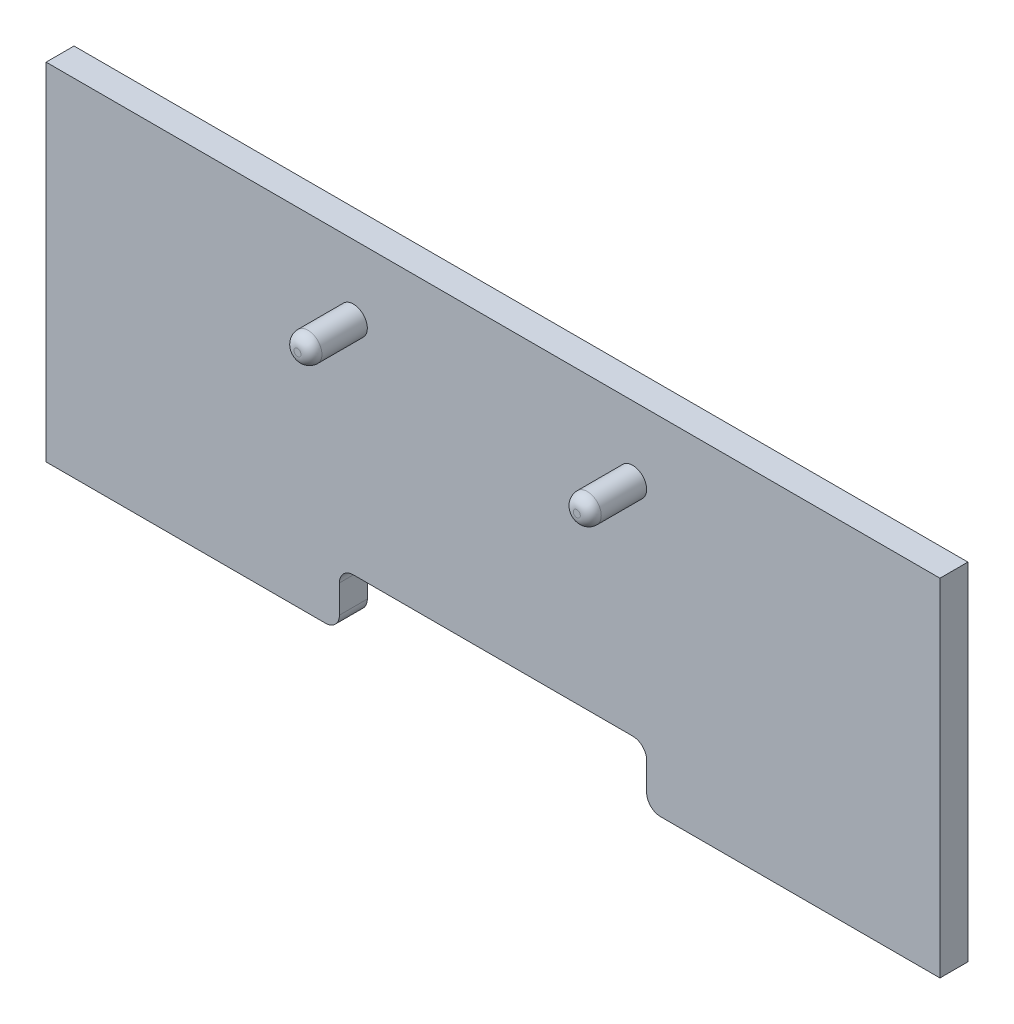
ISO-10303-21;
HEADER;
FILE_DESCRIPTION(('STEP AP214'),'2;1');
FILE_NAME('part.step','',(''),(''),'','','');
FILE_SCHEMA(('AUTOMOTIVE_DESIGN { 1 0 10303 214 1 1 1 1 }'));
ENDSEC;
DATA;
#1=APPLICATION_CONTEXT('core data for automotive mechanical design processes');
#2=APPLICATION_PROTOCOL_DEFINITION('international standard','automotive_design',2000,#1);
#3=PRODUCT_CONTEXT('',#1,'mechanical');
#4=PRODUCT('Part','Part','',(#3));
#5=PRODUCT_RELATED_PRODUCT_CATEGORY('part','',(#4));
#6=PRODUCT_DEFINITION_FORMATION('','',#4);
#7=PRODUCT_DEFINITION_CONTEXT('part definition',#1,'design');
#8=PRODUCT_DEFINITION('design','',#6,#7);
#9=PRODUCT_DEFINITION_SHAPE('','',#8);
#10=(LENGTH_UNIT() NAMED_UNIT(*) SI_UNIT(.MILLI.,.METRE.));
#11=(NAMED_UNIT(*) PLANE_ANGLE_UNIT() SI_UNIT($,.RADIAN.));
#12=(NAMED_UNIT(*) SI_UNIT($,.STERADIAN.) SOLID_ANGLE_UNIT());
#13=UNCERTAINTY_MEASURE_WITH_UNIT(LENGTH_MEASURE(1.E-05),#10,'distance_accuracy_value','');
#14=(GEOMETRIC_REPRESENTATION_CONTEXT(3) GLOBAL_UNCERTAINTY_ASSIGNED_CONTEXT((#13)) GLOBAL_UNIT_ASSIGNED_CONTEXT((#10,
#11,#12)) REPRESENTATION_CONTEXT('',''));
#15=CARTESIAN_POINT('',(0.,0.,0.));
#16=DIRECTION('',(0.,0.,1.));
#17=DIRECTION('',(1.,0.,0.));
#18=AXIS2_PLACEMENT_3D('',#15,#16,#17);
#19=CARTESIAN_POINT('',(0.,0.,6.35));
#20=DIRECTION('',(0.,1.,0.));
#21=DIRECTION('',(0.,0.,1.));
#22=AXIS2_PLACEMENT_3D('',#19,#20,#21);
#23=PLANE('',#22);
#24=DIRECTION('',(1.,0.,0.));
#25=VECTOR('',#24,1.);
#26=CARTESIAN_POINT('',(0.,0.,0.));
#27=LINE('',#26,#25);
#28=CARTESIAN_POINT('',(0.,0.,0.));
#29=VERTEX_POINT('',#28);
#30=CARTESIAN_POINT('',(63.5,0.,0.));
#31=VERTEX_POINT('',#30);
#32=EDGE_CURVE('E272',#29,#31,#27,.T.);
#33=ORIENTED_EDGE('',*,*,#32,.T.);
#34=DIRECTION('',(0.,0.,1.));
#35=VECTOR('',#34,1.);
#36=CARTESIAN_POINT('',(63.5,0.,6.35));
#37=LINE('',#36,#35);
#38=CARTESIAN_POINT('',(63.5,0.,6.35));
#39=VERTEX_POINT('',#38);
#40=EDGE_CURVE('E137',#31,#39,#37,.T.);
#41=ORIENTED_EDGE('',*,*,#40,.T.);
#42=DIRECTION('',(1.,0.,0.));
#43=VECTOR('',#42,1.);
#44=CARTESIAN_POINT('',(0.,0.,6.35));
#45=LINE('',#44,#43);
#46=CARTESIAN_POINT('',(0.,0.,6.35));
#47=VERTEX_POINT('',#46);
#48=EDGE_CURVE('E130',#47,#39,#45,.T.);
#49=ORIENTED_EDGE('',*,*,#48,.F.);
#50=DIRECTION('',(0.,0.,-1.));
#51=VECTOR('',#50,1.);
#52=CARTESIAN_POINT('',(0.,0.,6.35));
#53=LINE('',#52,#51);
#54=EDGE_CURVE('E134',#47,#29,#53,.T.);
#55=ORIENTED_EDGE('',*,*,#54,.T.);
#56=EDGE_LOOP('',(#33,#41,#49,#55));
#57=FACE_BOUND('',#56,.T.);
#58=ADVANCED_FACE('F38',(#57),#23,.F.);
#59=CARTESIAN_POINT('',(0.,0.,6.35));
#60=DIRECTION('',(1.,0.,0.));
#61=DIRECTION('',(0.,0.,-1.));
#62=AXIS2_PLACEMENT_3D('',#59,#60,#61);
#63=PLANE('',#62);
#64=DIRECTION('',(0.,-1.,0.));
#65=VECTOR('',#64,1.);
#66=CARTESIAN_POINT('',(0.,0.,0.));
#67=LINE('',#66,#65);
#68=CARTESIAN_POINT('',(0.,78.7146,0.));
#69=VERTEX_POINT('',#68);
#70=EDGE_CURVE('E155',#69,#29,#67,.T.);
#71=ORIENTED_EDGE('',*,*,#70,.T.);
#72=ORIENTED_EDGE('',*,*,#54,.F.);
#73=DIRECTION('',(0.,-1.,0.));
#74=VECTOR('',#73,1.);
#75=CARTESIAN_POINT('',(0.,0.,6.35));
#76=LINE('',#75,#74);
#77=CARTESIAN_POINT('',(0.,78.7146,6.35));
#78=VERTEX_POINT('',#77);
#79=EDGE_CURVE('E143',#78,#47,#76,.T.);
#80=ORIENTED_EDGE('',*,*,#79,.F.);
#81=DIRECTION('',(0.,0.,-1.));
#82=VECTOR('',#81,1.);
#83=CARTESIAN_POINT('',(0.,78.7146,6.35));
#84=LINE('',#83,#82);
#85=EDGE_CURVE('E270',#78,#69,#84,.T.);
#86=ORIENTED_EDGE('',*,*,#85,.T.);
#87=EDGE_LOOP('',(#71,#72,#80,#86));
#88=FACE_BOUND('',#87,.T.);
#89=ADVANCED_FACE('F153',(#88),#63,.F.);
#90=CARTESIAN_POINT('',(139.7,0.,6.35));
#91=VERTEX_POINT('',#90);
#92=CARTESIAN_POINT('',(203.2,0.,6.35));
#93=VERTEX_POINT('',#92);
#94=EDGE_CURVE('E140',#91,#93,#45,.T.);
#95=ORIENTED_EDGE('',*,*,#94,.F.);
#96=DIRECTION('',(0.,0.,1.));
#97=VECTOR('',#96,1.);
#98=CARTESIAN_POINT('',(139.7,0.,6.35));
#99=LINE('',#98,#97);
#100=CARTESIAN_POINT('',(139.7,0.,0.));
#101=VERTEX_POINT('',#100);
#102=EDGE_CURVE('E172',#91,#101,#99,.F.);
#103=ORIENTED_EDGE('',*,*,#102,.T.);
#104=CARTESIAN_POINT('',(203.2,0.,0.));
#105=VERTEX_POINT('',#104);
#106=EDGE_CURVE('E249',#101,#105,#27,.T.);
#107=ORIENTED_EDGE('',*,*,#106,.T.);
#108=DIRECTION('',(0.,0.,-1.));
#109=VECTOR('',#108,1.);
#110=CARTESIAN_POINT('',(203.2,0.,6.35));
#111=LINE('',#110,#109);
#112=EDGE_CURVE('E157',#93,#105,#111,.T.);
#113=ORIENTED_EDGE('',*,*,#112,.F.);
#114=EDGE_LOOP('',(#95,#103,#107,#113));
#115=FACE_BOUND('',#114,.T.);
#116=ADVANCED_FACE('F222',(#115),#23,.F.);
#117=CARTESIAN_POINT('',(203.2,0.,6.35));
#118=DIRECTION('',(-1.,0.,0.));
#119=DIRECTION('',(0.,0.,1.));
#120=AXIS2_PLACEMENT_3D('',#117,#118,#119);
#121=PLANE('',#120);
#122=DIRECTION('',(0.,1.,0.));
#123=VECTOR('',#122,1.);
#124=CARTESIAN_POINT('',(203.2,0.,0.));
#125=LINE('',#124,#123);
#126=CARTESIAN_POINT('',(203.2,78.7146,0.));
#127=VERTEX_POINT('',#126);
#128=EDGE_CURVE('E274',#105,#127,#125,.T.);
#129=ORIENTED_EDGE('',*,*,#128,.T.);
#130=DIRECTION('',(0.,0.,-1.));
#131=VECTOR('',#130,1.);
#132=CARTESIAN_POINT('',(203.2,78.7146,6.35));
#133=LINE('',#132,#131);
#134=CARTESIAN_POINT('',(203.2,78.7146,6.35));
#135=VERTEX_POINT('',#134);
#136=EDGE_CURVE('E162',#135,#127,#133,.T.);
#137=ORIENTED_EDGE('',*,*,#136,.F.);
#138=DIRECTION('',(0.,1.,0.));
#139=VECTOR('',#138,1.);
#140=CARTESIAN_POINT('',(203.2,0.,6.35));
#141=LINE('',#140,#139);
#142=EDGE_CURVE('E139',#93,#135,#141,.T.);
#143=ORIENTED_EDGE('',*,*,#142,.F.);
#144=ORIENTED_EDGE('',*,*,#112,.T.);
#145=EDGE_LOOP('',(#129,#137,#143,#144));
#146=FACE_BOUND('',#145,.T.);
#147=ADVANCED_FACE('F229',(#146),#121,.F.);
#148=CARTESIAN_POINT('',(0.,78.7146,6.35));
#149=DIRECTION('',(0.,-1.,0.));
#150=DIRECTION('',(0.,0.,-1.));
#151=AXIS2_PLACEMENT_3D('',#148,#149,#150);
#152=PLANE('',#151);
#153=DIRECTION('',(-1.,0.,0.));
#154=VECTOR('',#153,1.);
#155=CARTESIAN_POINT('',(0.,78.7146,0.));
#156=LINE('',#155,#154);
#157=EDGE_CURVE('E151',#127,#69,#156,.T.);
#158=ORIENTED_EDGE('',*,*,#157,.T.);
#159=ORIENTED_EDGE('',*,*,#85,.F.);
#160=DIRECTION('',(-1.,0.,0.));
#161=VECTOR('',#160,1.);
#162=CARTESIAN_POINT('',(0.,78.7146,6.35));
#163=LINE('',#162,#161);
#164=EDGE_CURVE('E147',#135,#78,#163,.T.);
#165=ORIENTED_EDGE('',*,*,#164,.F.);
#166=ORIENTED_EDGE('',*,*,#136,.T.);
#167=EDGE_LOOP('',(#158,#159,#165,#166));
#168=FACE_BOUND('',#167,.T.);
#169=ADVANCED_FACE('F234',(#168),#152,.F.);
#170=CARTESIAN_POINT('',(0.,0.,6.35));
#171=DIRECTION('',(0.,0.,-1.));
#172=DIRECTION('',(-1.,0.,0.));
#173=AXIS2_PLACEMENT_3D('',#170,#171,#172);
#174=PLANE('',#173);
#175=CARTESIAN_POINT('',(133.35,62.8396,6.35));
#176=DIRECTION('',(0.,0.,-1.));
#177=DIRECTION('',(-1.,0.,0.));
#178=AXIS2_PLACEMENT_3D('',#175,#176,#177);
#179=CIRCLE('',#178,3.175);
#180=CARTESIAN_POINT('',(130.175,62.8396,6.35));
#181=VERTEX_POINT('',#180);
#182=EDGE_CURVE('E198',#181,#181,#179,.F.);
#183=ORIENTED_EDGE('',*,*,#182,.F.);
#184=EDGE_LOOP('',(#183));
#185=FACE_BOUND('',#184,.T.);
#186=CARTESIAN_POINT('',(69.85,62.8396,6.35));
#187=DIRECTION('',(0.,0.,-1.));
#188=DIRECTION('',(-1.,0.,0.));
#189=AXIS2_PLACEMENT_3D('',#186,#187,#188);
#190=CIRCLE('',#189,3.175);
#191=CARTESIAN_POINT('',(66.675,62.8396,6.35));
#192=VERTEX_POINT('',#191);
#193=EDGE_CURVE('E195',#192,#192,#190,.F.);
#194=ORIENTED_EDGE('',*,*,#193,.F.);
#195=EDGE_LOOP('',(#194));
#196=FACE_BOUND('',#195,.T.);
#197=DIRECTION('',(0.,1.,0.));
#198=VECTOR('',#197,1.);
#199=CARTESIAN_POINT('',(136.525,0.,6.35));
#200=LINE('',#199,#198);
#201=CARTESIAN_POINT('',(136.525,3.175,6.35));
#202=VERTEX_POINT('',#201);
#203=CARTESIAN_POINT('',(136.525,9.52500000000001,6.35));
#204=VERTEX_POINT('',#203);
#205=EDGE_CURVE('E265',#202,#204,#200,.T.);
#206=ORIENTED_EDGE('',*,*,#205,.F.);
#207=CARTESIAN_POINT('',(139.7,3.175,6.35));
#208=DIRECTION('',(0.,0.,-1.));
#209=DIRECTION('',(-1.,0.,0.));
#210=AXIS2_PLACEMENT_3D('',#207,#208,#209);
#211=CIRCLE('',#210,3.175);
#212=EDGE_CURVE('E170',#202,#91,#211,.F.);
#213=ORIENTED_EDGE('',*,*,#212,.T.);
#214=ORIENTED_EDGE('',*,*,#94,.T.);
#215=ORIENTED_EDGE('',*,*,#142,.T.);
#216=ORIENTED_EDGE('',*,*,#164,.T.);
#217=ORIENTED_EDGE('',*,*,#79,.T.);
#218=ORIENTED_EDGE('',*,*,#48,.T.);
#219=CARTESIAN_POINT('',(63.5,3.175,6.35));
#220=DIRECTION('',(0.,0.,-1.));
#221=DIRECTION('',(-1.,0.,0.));
#222=AXIS2_PLACEMENT_3D('',#219,#220,#221);
#223=CIRCLE('',#222,3.175);
#224=CARTESIAN_POINT('',(66.675,3.175,6.35));
#225=VERTEX_POINT('',#224);
#226=EDGE_CURVE('E168',#39,#225,#223,.F.);
#227=ORIENTED_EDGE('',*,*,#226,.T.);
#228=DIRECTION('',(0.,-1.,0.));
#229=VECTOR('',#228,1.);
#230=CARTESIAN_POINT('',(66.675,0.,6.35));
#231=LINE('',#230,#229);
#232=CARTESIAN_POINT('',(66.675,9.525,6.35));
#233=VERTEX_POINT('',#232);
#234=EDGE_CURVE('E262',#233,#225,#231,.T.);
#235=ORIENTED_EDGE('',*,*,#234,.F.);
#236=CARTESIAN_POINT('',(69.85,9.525,6.35));
#237=DIRECTION('',(0.,0.,-1.));
#238=DIRECTION('',(-1.,0.,0.));
#239=AXIS2_PLACEMENT_3D('',#236,#237,#238);
#240=CIRCLE('',#239,3.175);
#241=CARTESIAN_POINT('',(69.85,12.7,6.35));
#242=VERTEX_POINT('',#241);
#243=EDGE_CURVE('E191',#233,#242,#240,.T.);
#244=ORIENTED_EDGE('',*,*,#243,.T.);
#245=DIRECTION('',(-1.,0.,0.));
#246=VECTOR('',#245,1.);
#247=CARTESIAN_POINT('',(66.675,12.7,6.35));
#248=LINE('',#247,#246);
#249=CARTESIAN_POINT('',(133.35,12.7,6.35));
#250=VERTEX_POINT('',#249);
#251=EDGE_CURVE('E259',#250,#242,#248,.T.);
#252=ORIENTED_EDGE('',*,*,#251,.F.);
#253=CARTESIAN_POINT('',(133.35,9.52500000000001,6.35));
#254=DIRECTION('',(0.,0.,-1.));
#255=DIRECTION('',(-1.,0.,0.));
#256=AXIS2_PLACEMENT_3D('',#253,#254,#255);
#257=CIRCLE('',#256,3.175);
#258=EDGE_CURVE('E188',#250,#204,#257,.T.);
#259=ORIENTED_EDGE('',*,*,#258,.T.);
#260=EDGE_LOOP('',(#206,#213,#214,#215,#216,#217,#218,#227,#235,#244,#252,#259));
#261=FACE_BOUND('',#260,.T.);
#262=ADVANCED_FACE('F145',(#185,#196,#261),#174,.F.);
#263=CARTESIAN_POINT('',(0.,0.,0.));
#264=DIRECTION('',(0.,0.,-1.));
#265=DIRECTION('',(-1.,0.,0.));
#266=AXIS2_PLACEMENT_3D('',#263,#264,#265);
#267=PLANE('',#266);
#268=ORIENTED_EDGE('',*,*,#106,.F.);
#269=CARTESIAN_POINT('',(139.7,3.175,0.));
#270=DIRECTION('',(0.,0.,-1.));
#271=DIRECTION('',(-1.,0.,0.));
#272=AXIS2_PLACEMENT_3D('',#269,#270,#271);
#273=CIRCLE('',#272,3.175);
#274=CARTESIAN_POINT('',(136.525,3.175,0.));
#275=VERTEX_POINT('',#274);
#276=EDGE_CURVE('E176',#101,#275,#273,.T.);
#277=ORIENTED_EDGE('',*,*,#276,.T.);
#278=DIRECTION('',(0.,1.,0.));
#279=VECTOR('',#278,1.);
#280=CARTESIAN_POINT('',(136.525,0.,0.));
#281=LINE('',#280,#279);
#282=CARTESIAN_POINT('',(136.525,9.52500000000001,0.));
#283=VERTEX_POINT('',#282);
#284=EDGE_CURVE('E247',#275,#283,#281,.T.);
#285=ORIENTED_EDGE('',*,*,#284,.T.);
#286=CARTESIAN_POINT('',(133.35,9.52500000000001,0.));
#287=DIRECTION('',(0.,0.,-1.));
#288=DIRECTION('',(-1.,0.,0.));
#289=AXIS2_PLACEMENT_3D('',#286,#287,#288);
#290=CIRCLE('',#289,3.175);
#291=CARTESIAN_POINT('',(133.35,12.7,0.));
#292=VERTEX_POINT('',#291);
#293=EDGE_CURVE('E60',#283,#292,#290,.F.);
#294=ORIENTED_EDGE('',*,*,#293,.T.);
#295=DIRECTION('',(-1.,0.,0.));
#296=VECTOR('',#295,1.);
#297=CARTESIAN_POINT('',(66.675,12.7,0.));
#298=LINE('',#297,#296);
#299=CARTESIAN_POINT('',(69.85,12.7,0.));
#300=VERTEX_POINT('',#299);
#301=EDGE_CURVE('E254',#292,#300,#298,.T.);
#302=ORIENTED_EDGE('',*,*,#301,.T.);
#303=CARTESIAN_POINT('',(69.85,9.525,0.));
#304=DIRECTION('',(0.,0.,-1.));
#305=DIRECTION('',(-1.,0.,0.));
#306=AXIS2_PLACEMENT_3D('',#303,#304,#305);
#307=CIRCLE('',#306,3.175);
#308=CARTESIAN_POINT('',(66.675,9.525,0.));
#309=VERTEX_POINT('',#308);
#310=EDGE_CURVE('E193',#300,#309,#307,.F.);
#311=ORIENTED_EDGE('',*,*,#310,.T.);
#312=DIRECTION('',(0.,-1.,0.));
#313=VECTOR('',#312,1.);
#314=CARTESIAN_POINT('',(66.675,0.,0.));
#315=LINE('',#314,#313);
#316=CARTESIAN_POINT('',(66.675,3.175,0.));
#317=VERTEX_POINT('',#316);
#318=EDGE_CURVE('E255',#309,#317,#315,.T.);
#319=ORIENTED_EDGE('',*,*,#318,.T.);
#320=CARTESIAN_POINT('',(63.5,3.175,0.));
#321=DIRECTION('',(0.,0.,-1.));
#322=DIRECTION('',(-1.,0.,0.));
#323=AXIS2_PLACEMENT_3D('',#320,#321,#322);
#324=CIRCLE('',#323,3.175);
#325=EDGE_CURVE('E174',#317,#31,#324,.T.);
#326=ORIENTED_EDGE('',*,*,#325,.T.);
#327=ORIENTED_EDGE('',*,*,#32,.F.);
#328=ORIENTED_EDGE('',*,*,#70,.F.);
#329=ORIENTED_EDGE('',*,*,#157,.F.);
#330=ORIENTED_EDGE('',*,*,#128,.F.);
#331=EDGE_LOOP('',(#268,#277,#285,#294,#302,#311,#319,#326,#327,#328,#329,#330));
#332=FACE_BOUND('',#331,.T.);
#333=ADVANCED_FACE('F246',(#332),#267,.T.);
#334=CARTESIAN_POINT('',(66.675,0.,0.));
#335=DIRECTION('',(-1.,0.,0.));
#336=DIRECTION('',(0.,0.,1.));
#337=AXIS2_PLACEMENT_3D('',#334,#335,#336);
#338=PLANE('',#337);
#339=ORIENTED_EDGE('',*,*,#318,.F.);
#340=DIRECTION('',(0.,0.,1.));
#341=VECTOR('',#340,1.);
#342=CARTESIAN_POINT('',(66.675,9.525,6.35));
#343=LINE('',#342,#341);
#344=EDGE_CURVE('E184',#309,#233,#343,.T.);
#345=ORIENTED_EDGE('',*,*,#344,.T.);
#346=ORIENTED_EDGE('',*,*,#234,.T.);
#347=DIRECTION('',(0.,0.,1.));
#348=VECTOR('',#347,1.);
#349=CARTESIAN_POINT('',(66.675,3.175,0.));
#350=LINE('',#349,#348);
#351=EDGE_CURVE('E182',#225,#317,#350,.F.);
#352=ORIENTED_EDGE('',*,*,#351,.T.);
#353=EDGE_LOOP('',(#339,#345,#346,#352));
#354=FACE_BOUND('',#353,.T.);
#355=ADVANCED_FACE('F288',(#354),#338,.F.);
#356=CARTESIAN_POINT('',(66.675,12.7,0.));
#357=DIRECTION('',(0.,1.,0.));
#358=DIRECTION('',(-1.,0.,0.));
#359=AXIS2_PLACEMENT_3D('',#356,#357,#358);
#360=PLANE('',#359);
#361=ORIENTED_EDGE('',*,*,#301,.F.);
#362=DIRECTION('',(0.,0.,1.));
#363=VECTOR('',#362,1.);
#364=CARTESIAN_POINT('',(133.35,12.7,6.35));
#365=LINE('',#364,#363);
#366=EDGE_CURVE('E179',#292,#250,#365,.T.);
#367=ORIENTED_EDGE('',*,*,#366,.T.);
#368=ORIENTED_EDGE('',*,*,#251,.T.);
#369=DIRECTION('',(0.,0.,1.));
#370=VECTOR('',#369,1.);
#371=CARTESIAN_POINT('',(69.85,12.7,0.));
#372=LINE('',#371,#370);
#373=EDGE_CURVE('E53',#242,#300,#372,.F.);
#374=ORIENTED_EDGE('',*,*,#373,.T.);
#375=EDGE_LOOP('',(#361,#367,#368,#374));
#376=FACE_BOUND('',#375,.T.);
#377=ADVANCED_FACE('F294',(#376),#360,.F.);
#378=CARTESIAN_POINT('',(136.525,0.,0.));
#379=DIRECTION('',(1.,0.,0.));
#380=DIRECTION('',(0.,0.,-1.));
#381=AXIS2_PLACEMENT_3D('',#378,#379,#380);
#382=PLANE('',#381);
#383=ORIENTED_EDGE('',*,*,#284,.F.);
#384=DIRECTION('',(0.,0.,1.));
#385=VECTOR('',#384,1.);
#386=CARTESIAN_POINT('',(136.525,3.175,0.));
#387=LINE('',#386,#385);
#388=EDGE_CURVE('E159',#275,#202,#387,.T.);
#389=ORIENTED_EDGE('',*,*,#388,.T.);
#390=ORIENTED_EDGE('',*,*,#205,.T.);
#391=DIRECTION('',(0.,0.,1.));
#392=VECTOR('',#391,1.);
#393=CARTESIAN_POINT('',(136.525,9.52500000000001,0.));
#394=LINE('',#393,#392);
#395=EDGE_CURVE('E156',#204,#283,#394,.F.);
#396=ORIENTED_EDGE('',*,*,#395,.T.);
#397=EDGE_LOOP('',(#383,#389,#390,#396));
#398=FACE_BOUND('',#397,.T.);
#399=ADVANCED_FACE('F251',(#398),#382,.F.);
#400=CARTESIAN_POINT('',(139.7,3.175,0.));
#401=DIRECTION('',(0.,0.,1.));
#402=DIRECTION('',(1.,0.,0.));
#403=AXIS2_PLACEMENT_3D('',#400,#401,#402);
#404=CYLINDRICAL_SURFACE('',#403,3.175);
#405=ORIENTED_EDGE('',*,*,#276,.F.);
#406=ORIENTED_EDGE('',*,*,#102,.F.);
#407=ORIENTED_EDGE('',*,*,#212,.F.);
#408=ORIENTED_EDGE('',*,*,#388,.F.);
#409=EDGE_LOOP('',(#405,#406,#407,#408));
#410=FACE_BOUND('',#409,.T.);
#411=ADVANCED_FACE('F243',(#410),#404,.T.);
#412=CARTESIAN_POINT('',(133.35,9.52500000000001,0.));
#413=DIRECTION('',(0.,0.,-1.));
#414=DIRECTION('',(-1.,0.,0.));
#415=AXIS2_PLACEMENT_3D('',#412,#413,#414);
#416=CYLINDRICAL_SURFACE('',#415,3.175);
#417=ORIENTED_EDGE('',*,*,#293,.F.);
#418=ORIENTED_EDGE('',*,*,#395,.F.);
#419=ORIENTED_EDGE('',*,*,#258,.F.);
#420=ORIENTED_EDGE('',*,*,#366,.F.);
#421=EDGE_LOOP('',(#417,#418,#419,#420));
#422=FACE_BOUND('',#421,.T.);
#423=ADVANCED_FACE('F297',(#422),#416,.F.);
#424=CARTESIAN_POINT('',(69.85,9.525,0.));
#425=DIRECTION('',(0.,0.,-1.));
#426=DIRECTION('',(-1.,0.,0.));
#427=AXIS2_PLACEMENT_3D('',#424,#425,#426);
#428=CYLINDRICAL_SURFACE('',#427,3.175);
#429=ORIENTED_EDGE('',*,*,#310,.F.);
#430=ORIENTED_EDGE('',*,*,#373,.F.);
#431=ORIENTED_EDGE('',*,*,#243,.F.);
#432=ORIENTED_EDGE('',*,*,#344,.F.);
#433=EDGE_LOOP('',(#429,#430,#431,#432));
#434=FACE_BOUND('',#433,.T.);
#435=ADVANCED_FACE('F292',(#434),#428,.F.);
#436=CARTESIAN_POINT('',(63.5,3.175,6.35));
#437=DIRECTION('',(0.,0.,1.));
#438=DIRECTION('',(1.,0.,0.));
#439=AXIS2_PLACEMENT_3D('',#436,#437,#438);
#440=CYLINDRICAL_SURFACE('',#439,3.175);
#441=ORIENTED_EDGE('',*,*,#325,.F.);
#442=ORIENTED_EDGE('',*,*,#351,.F.);
#443=ORIENTED_EDGE('',*,*,#226,.F.);
#444=ORIENTED_EDGE('',*,*,#40,.F.);
#445=EDGE_LOOP('',(#441,#442,#443,#444));
#446=FACE_BOUND('',#445,.T.);
#447=ADVANCED_FACE('F283',(#446),#440,.T.);
#448=CARTESIAN_POINT('',(69.85,62.8396,19.05));
#449=DIRECTION('',(0.,0.,-1.));
#450=DIRECTION('',(-1.,0.,0.));
#451=AXIS2_PLACEMENT_3D('',#448,#449,#450);
#452=CYLINDRICAL_SURFACE('',#451,3.175);
#453=CARTESIAN_POINT('',(69.85,62.8396,16.66875));
#454=DIRECTION('',(0.,0.,1.));
#455=DIRECTION('',(1.,0.,0.));
#456=AXIS2_PLACEMENT_3D('',#453,#454,#455);
#457=CIRCLE('',#456,3.175);
#458=CARTESIAN_POINT('',(73.025,62.8396,16.66875));
#459=VERTEX_POINT('',#458);
#460=EDGE_CURVE('E11',#459,#459,#457,.F.);
#461=ORIENTED_EDGE('',*,*,#460,.T.);
#462=EDGE_LOOP('',(#461));
#463=FACE_BOUND('',#462,.T.);
#464=ORIENTED_EDGE('',*,*,#193,.T.);
#465=EDGE_LOOP('',(#464));
#466=FACE_BOUND('',#465,.T.);
#467=ADVANCED_FACE('F308',(#463,#466),#452,.T.);
#468=CARTESIAN_POINT('',(69.85,62.8396,19.05));
#469=DIRECTION('',(0.,0.,1.));
#470=DIRECTION('',(1.,0.,0.));
#471=AXIS2_PLACEMENT_3D('',#468,#469,#470);
#472=PLANE('',#471);
#473=CARTESIAN_POINT('',(69.85,62.8396,19.05));
#474=DIRECTION('',(0.,0.,1.));
#475=DIRECTION('',(1.,0.,0.));
#476=AXIS2_PLACEMENT_3D('',#473,#474,#475);
#477=CIRCLE('',#476,0.793749999999997);
#478=CARTESIAN_POINT('',(70.64375,62.8396,19.05));
#479=VERTEX_POINT('',#478);
#480=EDGE_CURVE('E46',#479,#479,#477,.T.);
#481=ORIENTED_EDGE('',*,*,#480,.T.);
#482=EDGE_LOOP('',(#481));
#483=FACE_BOUND('',#482,.T.);
#484=ADVANCED_FACE('F209',(#483),#472,.T.);
#485=CARTESIAN_POINT('',(133.35,62.8396,19.05));
#486=DIRECTION('',(0.,0.,-1.));
#487=DIRECTION('',(-1.,0.,0.));
#488=AXIS2_PLACEMENT_3D('',#485,#486,#487);
#489=CYLINDRICAL_SURFACE('',#488,3.175);
#490=CARTESIAN_POINT('',(133.35,62.8396,16.66875));
#491=DIRECTION('',(0.,0.,1.));
#492=DIRECTION('',(1.,0.,0.));
#493=AXIS2_PLACEMENT_3D('',#490,#491,#492);
#494=CIRCLE('',#493,3.175);
#495=CARTESIAN_POINT('',(136.525,62.8396,16.66875));
#496=VERTEX_POINT('',#495);
#497=EDGE_CURVE('E204',#496,#496,#494,.F.);
#498=ORIENTED_EDGE('',*,*,#497,.T.);
#499=EDGE_LOOP('',(#498));
#500=FACE_BOUND('',#499,.T.);
#501=ORIENTED_EDGE('',*,*,#182,.T.);
#502=EDGE_LOOP('',(#501));
#503=FACE_BOUND('',#502,.T.);
#504=ADVANCED_FACE('F317',(#500,#503),#489,.T.);
#505=CARTESIAN_POINT('',(133.35,62.8396,19.05));
#506=DIRECTION('',(0.,0.,1.));
#507=DIRECTION('',(1.,0.,0.));
#508=AXIS2_PLACEMENT_3D('',#505,#506,#507);
#509=PLANE('',#508);
#510=CARTESIAN_POINT('',(133.35,62.8396,19.05));
#511=DIRECTION('',(0.,0.,1.));
#512=DIRECTION('',(1.,0.,0.));
#513=AXIS2_PLACEMENT_3D('',#510,#511,#512);
#514=CIRCLE('',#513,0.793749999999997);
#515=CARTESIAN_POINT('',(134.14375,62.8396,19.05));
#516=VERTEX_POINT('',#515);
#517=EDGE_CURVE('E201',#516,#516,#514,.T.);
#518=ORIENTED_EDGE('',*,*,#517,.T.);
#519=EDGE_LOOP('',(#518));
#520=FACE_BOUND('',#519,.T.);
#521=ADVANCED_FACE('F217',(#520),#509,.T.);
#522=CARTESIAN_POINT('',(133.35,62.8396,16.66875));
#523=DIRECTION('',(0.,0.,1.));
#524=DIRECTION('',(1.,0.,0.));
#525=AXIS2_PLACEMENT_3D('',#522,#523,#524);
#526=DEGENERATE_TOROIDAL_SURFACE('',#525,0.793749999999997,2.38125,.T.);
#527=ORIENTED_EDGE('',*,*,#497,.F.);
#528=EDGE_LOOP('',(#527));
#529=FACE_BOUND('',#528,.T.);
#530=ORIENTED_EDGE('',*,*,#517,.F.);
#531=EDGE_LOOP('',(#530));
#532=FACE_BOUND('',#531,.T.);
#533=ADVANCED_FACE('F212',(#529,#532),#526,.T.);
#534=CARTESIAN_POINT('',(69.85,62.8396,16.66875));
#535=DIRECTION('',(0.,0.,1.));
#536=DIRECTION('',(1.,0.,0.));
#537=AXIS2_PLACEMENT_3D('',#534,#535,#536);
#538=DEGENERATE_TOROIDAL_SURFACE('',#537,0.793749999999997,2.38125,.T.);
#539=ORIENTED_EDGE('',*,*,#460,.F.);
#540=EDGE_LOOP('',(#539));
#541=FACE_BOUND('',#540,.T.);
#542=ORIENTED_EDGE('',*,*,#480,.F.);
#543=EDGE_LOOP('',(#542));
#544=FACE_BOUND('',#543,.T.);
#545=ADVANCED_FACE('F40',(#541,#544),#538,.T.);
#546=CLOSED_SHELL('',(#58,#89,#116,#147,#169,#262,#333,#355,#377,#399,#411,#423,#435,#447,#467,
#484,#504,#521,#533,#545));
#547=MANIFOLD_SOLID_BREP('B2',#546);
#548=ADVANCED_BREP_SHAPE_REPRESENTATION('',(#18,#547),#14);
#549=SHAPE_DEFINITION_REPRESENTATION(#9,#548);
ENDSEC;
END-ISO-10303-21;
